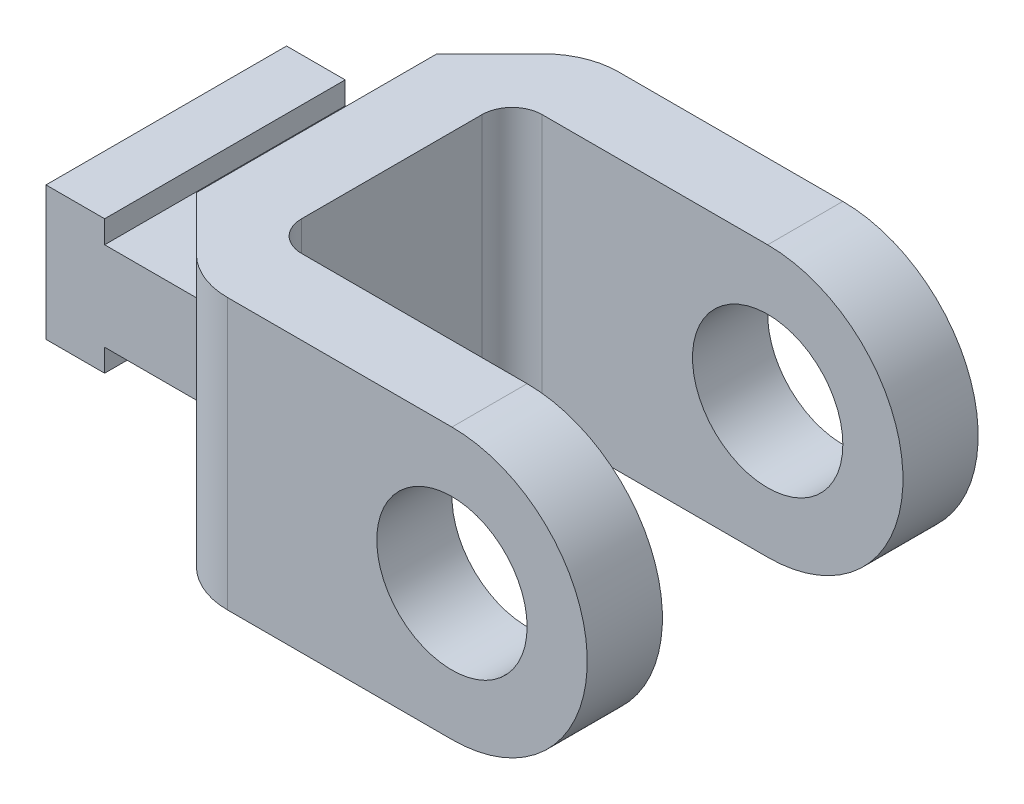
ISO-10303-21;
HEADER;
FILE_DESCRIPTION(('STEP AP214'),'2;1');
FILE_NAME('part.step','',(''),(''),'','','');
FILE_SCHEMA(('AUTOMOTIVE_DESIGN { 1 0 10303 214 1 1 1 1 }'));
ENDSEC;
DATA;
#1=APPLICATION_CONTEXT('core data for automotive mechanical design processes');
#2=APPLICATION_PROTOCOL_DEFINITION('international standard','automotive_design',2000,#1);
#3=PRODUCT_CONTEXT('',#1,'mechanical');
#4=PRODUCT('Part','Part','',(#3));
#5=PRODUCT_RELATED_PRODUCT_CATEGORY('part','',(#4));
#6=PRODUCT_DEFINITION_FORMATION('','',#4);
#7=PRODUCT_DEFINITION_CONTEXT('part definition',#1,'design');
#8=PRODUCT_DEFINITION('design','',#6,#7);
#9=PRODUCT_DEFINITION_SHAPE('','',#8);
#10=(LENGTH_UNIT() NAMED_UNIT(*) SI_UNIT(.MILLI.,.METRE.));
#11=(NAMED_UNIT(*) PLANE_ANGLE_UNIT() SI_UNIT($,.RADIAN.));
#12=(NAMED_UNIT(*) SI_UNIT($,.STERADIAN.) SOLID_ANGLE_UNIT());
#13=UNCERTAINTY_MEASURE_WITH_UNIT(LENGTH_MEASURE(1.E-05),#10,'distance_accuracy_value','');
#14=(GEOMETRIC_REPRESENTATION_CONTEXT(3) GLOBAL_UNCERTAINTY_ASSIGNED_CONTEXT((#13)) GLOBAL_UNIT_ASSIGNED_CONTEXT((#10,
#11,#12)) REPRESENTATION_CONTEXT('',''));
#15=CARTESIAN_POINT('',(0.,0.,0.));
#16=DIRECTION('',(0.,0.,1.));
#17=DIRECTION('',(1.,0.,0.));
#18=AXIS2_PLACEMENT_3D('',#15,#16,#17);
#19=CARTESIAN_POINT('',(1.25,4.5,8.));
#20=DIRECTION('',(0.,-1.,0.));
#21=DIRECTION('',(0.,0.,-1.));
#22=AXIS2_PLACEMENT_3D('',#19,#20,#21);
#23=PLANE('',#22);
#24=DIRECTION('',(-0.707106781186548,0.,-0.707106781186547));
#25=VECTOR('',#24,1.);
#26=CARTESIAN_POINT('',(0.,4.5,9.25));
#27=LINE('',#26,#25);
#28=CARTESIAN_POINT('',(0.517766952966368,4.5,9.76776695296637));
#29=VERTEX_POINT('',#28);
#30=CARTESIAN_POINT('',(-1.25,4.5,8.));
#31=VERTEX_POINT('',#30);
#32=EDGE_CURVE('E193',#29,#31,#27,.T.);
#33=ORIENTED_EDGE('',*,*,#32,.F.);
#34=CARTESIAN_POINT('',(2.28553390593274,4.5,8.));
#35=DIRECTION('',(0.,-1.,0.));
#36=DIRECTION('',(0.,0.,-1.));
#37=AXIS2_PLACEMENT_3D('',#34,#35,#36);
#38=CIRCLE('',#37,2.5);
#39=CARTESIAN_POINT('',(2.28553390593274,4.5,10.5));
#40=VERTEX_POINT('',#39);
#41=EDGE_CURVE('E55',#29,#40,#38,.F.);
#42=ORIENTED_EDGE('',*,*,#41,.T.);
#43=DIRECTION('',(-1.,0.,0.));
#44=VECTOR('',#43,1.);
#45=CARTESIAN_POINT('',(9.75,4.5,10.5));
#46=LINE('',#45,#44);
#47=CARTESIAN_POINT('',(9.75,4.5,10.5));
#48=VERTEX_POINT('',#47);
#49=EDGE_CURVE('E279',#48,#40,#46,.T.);
#50=ORIENTED_EDGE('',*,*,#49,.F.);
#51=DIRECTION('',(0.,0.,-1.));
#52=VECTOR('',#51,1.);
#53=CARTESIAN_POINT('',(9.75,4.5,10.5));
#54=LINE('',#53,#52);
#55=CARTESIAN_POINT('',(9.75,4.5,8.));
#56=VERTEX_POINT('',#55);
#57=EDGE_CURVE('E286',#48,#56,#54,.T.);
#58=ORIENTED_EDGE('',*,*,#57,.T.);
#59=DIRECTION('',(-1.,0.,0.));
#60=VECTOR('',#59,1.);
#61=CARTESIAN_POINT('',(9.75,4.5,8.));
#62=LINE('',#61,#60);
#63=CARTESIAN_POINT('',(2.25,4.5,8.));
#64=VERTEX_POINT('',#63);
#65=EDGE_CURVE('E277',#56,#64,#62,.T.);
#66=ORIENTED_EDGE('',*,*,#65,.T.);
#67=CARTESIAN_POINT('',(2.25,4.5,7.));
#68=DIRECTION('',(0.,-1.,0.));
#69=DIRECTION('',(0.,0.,-1.));
#70=AXIS2_PLACEMENT_3D('',#67,#68,#69);
#71=CIRCLE('',#70,1.);
#72=CARTESIAN_POINT('',(1.25,4.5,7.));
#73=VERTEX_POINT('',#72);
#74=EDGE_CURVE('E260',#64,#73,#71,.T.);
#75=ORIENTED_EDGE('',*,*,#74,.T.);
#76=DIRECTION('',(0.,0.,-1.));
#77=VECTOR('',#76,1.);
#78=CARTESIAN_POINT('',(1.25,4.5,8.));
#79=LINE('',#78,#77);
#80=CARTESIAN_POINT('',(1.25,4.5,1.));
#81=VERTEX_POINT('',#80);
#82=EDGE_CURVE('E233',#73,#81,#79,.T.);
#83=ORIENTED_EDGE('',*,*,#82,.T.);
#84=CARTESIAN_POINT('',(2.25,4.5,1.));
#85=DIRECTION('',(0.,-1.,0.));
#86=DIRECTION('',(0.,0.,-1.));
#87=AXIS2_PLACEMENT_3D('',#84,#85,#86);
#88=CIRCLE('',#87,1.);
#89=CARTESIAN_POINT('',(2.25,4.5,0.));
#90=VERTEX_POINT('',#89);
#91=EDGE_CURVE('E241',#81,#90,#88,.T.);
#92=ORIENTED_EDGE('',*,*,#91,.T.);
#93=DIRECTION('',(-1.,0.,0.));
#94=VECTOR('',#93,1.);
#95=CARTESIAN_POINT('',(9.75,4.5,0.));
#96=LINE('',#95,#94);
#97=CARTESIAN_POINT('',(9.75,4.5,0.));
#98=VERTEX_POINT('',#97);
#99=EDGE_CURVE('E314',#98,#90,#96,.T.);
#100=ORIENTED_EDGE('',*,*,#99,.F.);
#101=DIRECTION('',(0.,0.,1.));
#102=VECTOR('',#101,1.);
#103=CARTESIAN_POINT('',(9.75,4.5,-2.5));
#104=LINE('',#103,#102);
#105=CARTESIAN_POINT('',(9.75,4.5,-2.5));
#106=VERTEX_POINT('',#105);
#107=EDGE_CURVE('E329',#106,#98,#104,.T.);
#108=ORIENTED_EDGE('',*,*,#107,.F.);
#109=DIRECTION('',(-1.,0.,0.));
#110=VECTOR('',#109,1.);
#111=CARTESIAN_POINT('',(9.75,4.5,-2.5));
#112=LINE('',#111,#110);
#113=CARTESIAN_POINT('',(2.28553390593274,4.5,-2.5));
#114=VERTEX_POINT('',#113);
#115=EDGE_CURVE('E317',#106,#114,#112,.T.);
#116=ORIENTED_EDGE('',*,*,#115,.T.);
#117=CARTESIAN_POINT('',(2.28553390593274,4.5,0.));
#118=DIRECTION('',(0.,-1.,0.));
#119=DIRECTION('',(0.,0.,-1.));
#120=AXIS2_PLACEMENT_3D('',#117,#118,#119);
#121=CIRCLE('',#120,2.5);
#122=CARTESIAN_POINT('',(0.517766952966369,4.5,-1.76776695296637));
#123=VERTEX_POINT('',#122);
#124=EDGE_CURVE('E249',#114,#123,#121,.F.);
#125=ORIENTED_EDGE('',*,*,#124,.T.);
#126=DIRECTION('',(-0.707106781186548,0.,0.707106781186547));
#127=VECTOR('',#126,1.);
#128=CARTESIAN_POINT('',(-4.,4.5,2.75));
#129=LINE('',#128,#127);
#130=CARTESIAN_POINT('',(-1.25,4.5,0.));
#131=VERTEX_POINT('',#130);
#132=EDGE_CURVE('E302',#123,#131,#129,.T.);
#133=ORIENTED_EDGE('',*,*,#132,.T.);
#134=DIRECTION('',(0.,0.,-1.));
#135=VECTOR('',#134,1.);
#136=CARTESIAN_POINT('',(-1.25,4.5,8.));
#137=LINE('',#136,#135);
#138=EDGE_CURVE('E231',#31,#131,#137,.T.);
#139=ORIENTED_EDGE('',*,*,#138,.F.);
#140=EDGE_LOOP('',(#33,#42,#50,#58,#66,#75,#83,#92,#100,#108,#116,#125,#133,#139));
#141=FACE_BOUND('',#140,.T.);
#142=ADVANCED_FACE('F33',(#141),#23,.F.);
#143=CARTESIAN_POINT('',(-1.25,-1.475,8.));
#144=DIRECTION('',(1.,0.,0.));
#145=DIRECTION('',(0.,1.,0.));
#146=AXIS2_PLACEMENT_3D('',#143,#144,#145);
#147=PLANE('',#146);
#148=DIRECTION('',(0.,1.,0.));
#149=VECTOR('',#148,1.);
#150=CARTESIAN_POINT('',(-1.25,-4.5,8.));
#151=LINE('',#150,#149);
#152=CARTESIAN_POINT('',(-1.25,1.475,8.));
#153=VERTEX_POINT('',#152);
#154=EDGE_CURVE('E194',#153,#31,#151,.T.);
#155=ORIENTED_EDGE('',*,*,#154,.T.);
#156=ORIENTED_EDGE('',*,*,#138,.T.);
#157=DIRECTION('',(0.,1.,0.));
#158=VECTOR('',#157,1.);
#159=CARTESIAN_POINT('',(-1.25,-4.5,0.));
#160=LINE('',#159,#158);
#161=CARTESIAN_POINT('',(-1.25,1.475,0.));
#162=VERTEX_POINT('',#161);
#163=EDGE_CURVE('E300',#162,#131,#160,.T.);
#164=ORIENTED_EDGE('',*,*,#163,.F.);
#165=DIRECTION('',(0.,0.,-1.));
#166=VECTOR('',#165,1.);
#167=CARTESIAN_POINT('',(-1.25,1.475,8.));
#168=LINE('',#167,#166);
#169=EDGE_CURVE('E228',#153,#162,#168,.T.);
#170=ORIENTED_EDGE('',*,*,#169,.F.);
#171=EDGE_LOOP('',(#155,#156,#164,#170));
#172=FACE_BOUND('',#171,.T.);
#173=ADVANCED_FACE('F385',(#172),#147,.F.);
#174=CARTESIAN_POINT('',(-1.25,-4.5,8.));
#175=VERTEX_POINT('',#174);
#176=CARTESIAN_POINT('',(-1.25,-1.475,8.));
#177=VERTEX_POINT('',#176);
#178=EDGE_CURVE('E181',#175,#177,#151,.T.);
#179=ORIENTED_EDGE('',*,*,#178,.T.);
#180=DIRECTION('',(0.,0.,-1.));
#181=VECTOR('',#180,1.);
#182=CARTESIAN_POINT('',(-1.25,-1.475,8.));
#183=LINE('',#182,#181);
#184=CARTESIAN_POINT('',(-1.25,-1.475,0.));
#185=VERTEX_POINT('',#184);
#186=EDGE_CURVE('E206',#177,#185,#183,.T.);
#187=ORIENTED_EDGE('',*,*,#186,.T.);
#188=CARTESIAN_POINT('',(-1.25,-4.5,0.));
#189=VERTEX_POINT('',#188);
#190=EDGE_CURVE('E205',#189,#185,#160,.T.);
#191=ORIENTED_EDGE('',*,*,#190,.F.);
#192=DIRECTION('',(0.,0.,-1.));
#193=VECTOR('',#192,1.);
#194=CARTESIAN_POINT('',(-1.25,-4.5,8.));
#195=LINE('',#194,#193);
#196=EDGE_CURVE('E199',#175,#189,#195,.T.);
#197=ORIENTED_EDGE('',*,*,#196,.F.);
#198=EDGE_LOOP('',(#179,#187,#191,#197));
#199=FACE_BOUND('',#198,.T.);
#200=ADVANCED_FACE('F204',(#199),#147,.F.);
#201=CARTESIAN_POINT('',(1.25,-4.5,8.));
#202=DIRECTION('',(0.,-1.,0.));
#203=DIRECTION('',(0.,0.,-1.));
#204=AXIS2_PLACEMENT_3D('',#201,#202,#203);
#205=PLANE('',#204);
#206=DIRECTION('',(1.,0.,0.));
#207=VECTOR('',#206,1.);
#208=CARTESIAN_POINT('',(9.75,-4.5,10.5));
#209=LINE('',#208,#207);
#210=CARTESIAN_POINT('',(2.28553390593274,-4.5,10.5));
#211=VERTEX_POINT('',#210);
#212=CARTESIAN_POINT('',(9.75,-4.5,10.5));
#213=VERTEX_POINT('',#212);
#214=EDGE_CURVE('E284',#211,#213,#209,.T.);
#215=ORIENTED_EDGE('',*,*,#214,.F.);
#216=CARTESIAN_POINT('',(2.28553390593274,-4.5,8.));
#217=DIRECTION('',(0.,-1.,0.));
#218=DIRECTION('',(0.,0.,-1.));
#219=AXIS2_PLACEMENT_3D('',#216,#217,#218);
#220=CIRCLE('',#219,2.5);
#221=CARTESIAN_POINT('',(0.517766952966369,-4.5,9.76776695296637));
#222=VERTEX_POINT('',#221);
#223=EDGE_CURVE('E11',#211,#222,#220,.T.);
#224=ORIENTED_EDGE('',*,*,#223,.T.);
#225=DIRECTION('',(0.707106781186548,0.,0.707106781186547));
#226=VECTOR('',#225,1.);
#227=CARTESIAN_POINT('',(-1.25,-4.5,8.));
#228=LINE('',#227,#226);
#229=EDGE_CURVE('E185',#175,#222,#228,.T.);
#230=ORIENTED_EDGE('',*,*,#229,.F.);
#231=ORIENTED_EDGE('',*,*,#196,.T.);
#232=DIRECTION('',(0.707106781186548,0.,-0.707106781186547));
#233=VECTOR('',#232,1.);
#234=CARTESIAN_POINT('',(-1.25,-4.5,0.));
#235=LINE('',#234,#233);
#236=CARTESIAN_POINT('',(0.51776695296637,-4.5,-1.76776695296637));
#237=VERTEX_POINT('',#236);
#238=EDGE_CURVE('E296',#189,#237,#235,.T.);
#239=ORIENTED_EDGE('',*,*,#238,.T.);
#240=CARTESIAN_POINT('',(2.28553390593274,-4.5,0.));
#241=DIRECTION('',(0.,-1.,0.));
#242=DIRECTION('',(0.,0.,-1.));
#243=AXIS2_PLACEMENT_3D('',#240,#241,#242);
#244=CIRCLE('',#243,2.5);
#245=CARTESIAN_POINT('',(2.28553390593274,-4.5,-2.5));
#246=VERTEX_POINT('',#245);
#247=EDGE_CURVE('E253',#237,#246,#244,.T.);
#248=ORIENTED_EDGE('',*,*,#247,.T.);
#249=DIRECTION('',(1.,0.,0.));
#250=VECTOR('',#249,1.);
#251=CARTESIAN_POINT('',(9.75,-4.5,-2.5));
#252=LINE('',#251,#250);
#253=CARTESIAN_POINT('',(9.75,-4.5,-2.5));
#254=VERTEX_POINT('',#253);
#255=EDGE_CURVE('E311',#246,#254,#252,.T.);
#256=ORIENTED_EDGE('',*,*,#255,.T.);
#257=DIRECTION('',(0.,0.,1.));
#258=VECTOR('',#257,1.);
#259=CARTESIAN_POINT('',(9.75,-4.5,-2.5));
#260=LINE('',#259,#258);
#261=CARTESIAN_POINT('',(9.75,-4.5,0.));
#262=VERTEX_POINT('',#261);
#263=EDGE_CURVE('E320',#254,#262,#260,.T.);
#264=ORIENTED_EDGE('',*,*,#263,.T.);
#265=DIRECTION('',(1.,0.,0.));
#266=VECTOR('',#265,1.);
#267=CARTESIAN_POINT('',(9.75,-4.5,0.));
#268=LINE('',#267,#266);
#269=CARTESIAN_POINT('',(2.25,-4.5,0.));
#270=VERTEX_POINT('',#269);
#271=EDGE_CURVE('E308',#270,#262,#268,.T.);
#272=ORIENTED_EDGE('',*,*,#271,.F.);
#273=CARTESIAN_POINT('',(2.25,-4.5,1.));
#274=DIRECTION('',(0.,-1.,0.));
#275=DIRECTION('',(0.,0.,-1.));
#276=AXIS2_PLACEMENT_3D('',#273,#274,#275);
#277=CIRCLE('',#276,1.);
#278=CARTESIAN_POINT('',(1.25,-4.5,1.));
#279=VERTEX_POINT('',#278);
#280=EDGE_CURVE('E243',#270,#279,#277,.F.);
#281=ORIENTED_EDGE('',*,*,#280,.T.);
#282=DIRECTION('',(0.,0.,-1.));
#283=VECTOR('',#282,1.);
#284=CARTESIAN_POINT('',(1.25,-4.5,8.));
#285=LINE('',#284,#283);
#286=CARTESIAN_POINT('',(1.25,-4.5,7.));
#287=VERTEX_POINT('',#286);
#288=EDGE_CURVE('E207',#287,#279,#285,.T.);
#289=ORIENTED_EDGE('',*,*,#288,.F.);
#290=CARTESIAN_POINT('',(2.25,-4.5,7.));
#291=DIRECTION('',(0.,-1.,0.));
#292=DIRECTION('',(0.,0.,-1.));
#293=AXIS2_PLACEMENT_3D('',#290,#291,#292);
#294=CIRCLE('',#293,1.);
#295=CARTESIAN_POINT('',(2.25,-4.5,8.));
#296=VERTEX_POINT('',#295);
#297=EDGE_CURVE('E262',#287,#296,#294,.F.);
#298=ORIENTED_EDGE('',*,*,#297,.T.);
#299=DIRECTION('',(1.,0.,0.));
#300=VECTOR('',#299,1.);
#301=CARTESIAN_POINT('',(9.75,-4.5,8.));
#302=LINE('',#301,#300);
#303=CARTESIAN_POINT('',(9.75,-4.5,8.));
#304=VERTEX_POINT('',#303);
#305=EDGE_CURVE('E282',#296,#304,#302,.T.);
#306=ORIENTED_EDGE('',*,*,#305,.T.);
#307=DIRECTION('',(0.,0.,-1.));
#308=VECTOR('',#307,1.);
#309=CARTESIAN_POINT('',(9.75,-4.5,10.5));
#310=LINE('',#309,#308);
#311=EDGE_CURVE('E293',#213,#304,#310,.T.);
#312=ORIENTED_EDGE('',*,*,#311,.F.);
#313=EDGE_LOOP('',(#215,#224,#230,#231,#239,#248,#256,#264,#272,#281,#289,#298,#306,#312));
#314=FACE_BOUND('',#313,.T.);
#315=ADVANCED_FACE('F197',(#314),#205,.T.);
#316=CARTESIAN_POINT('',(9.75,0.,10.5));
#317=DIRECTION('',(0.,0.,-1.));
#318=DIRECTION('',(1.,0.,0.));
#319=AXIS2_PLACEMENT_3D('',#316,#317,#318);
#320=PLANE('',#319);
#321=CARTESIAN_POINT('',(9.75,0.,10.5));
#322=DIRECTION('',(0.,0.,1.));
#323=DIRECTION('',(1.,0.,0.));
#324=AXIS2_PLACEMENT_3D('',#321,#322,#323);
#325=CIRCLE('',#324,2.5);
#326=CARTESIAN_POINT('',(12.25,0.,10.5));
#327=VERTEX_POINT('',#326);
#328=EDGE_CURVE('E273',#327,#327,#325,.T.);
#329=ORIENTED_EDGE('',*,*,#328,.F.);
#330=EDGE_LOOP('',(#329));
#331=FACE_BOUND('',#330,.T.);
#332=ORIENTED_EDGE('',*,*,#49,.T.);
#333=DIRECTION('',(0.,1.,0.));
#334=VECTOR('',#333,1.);
#335=CARTESIAN_POINT('',(2.28553390593274,-4.5,10.5));
#336=LINE('',#335,#334);
#337=EDGE_CURVE('E41',#40,#211,#336,.F.);
#338=ORIENTED_EDGE('',*,*,#337,.T.);
#339=ORIENTED_EDGE('',*,*,#214,.T.);
#340=CARTESIAN_POINT('',(9.75,0.,10.5));
#341=DIRECTION('',(0.,0.,1.));
#342=DIRECTION('',(1.,0.,0.));
#343=AXIS2_PLACEMENT_3D('',#340,#341,#342);
#344=CIRCLE('',#343,4.5);
#345=EDGE_CURVE('E281',#213,#48,#344,.T.);
#346=ORIENTED_EDGE('',*,*,#345,.T.);
#347=EDGE_LOOP('',(#332,#338,#339,#346));
#348=FACE_BOUND('',#347,.T.);
#349=ADVANCED_FACE('F428',(#331,#348),#320,.F.);
#350=CARTESIAN_POINT('',(1.25,-4.5,8.));
#351=DIRECTION('',(-1.,0.,0.));
#352=DIRECTION('',(0.,0.,1.));
#353=AXIS2_PLACEMENT_3D('',#350,#351,#352);
#354=PLANE('',#353);
#355=ORIENTED_EDGE('',*,*,#82,.F.);
#356=DIRECTION('',(0.,1.,0.));
#357=VECTOR('',#356,1.);
#358=CARTESIAN_POINT('',(1.25,-4.5,7.));
#359=LINE('',#358,#357);
#360=EDGE_CURVE('E258',#73,#287,#359,.F.);
#361=ORIENTED_EDGE('',*,*,#360,.T.);
#362=ORIENTED_EDGE('',*,*,#288,.T.);
#363=DIRECTION('',(0.,1.,0.));
#364=VECTOR('',#363,1.);
#365=CARTESIAN_POINT('',(1.25,-4.5,1.));
#366=LINE('',#365,#364);
#367=EDGE_CURVE('E236',#279,#81,#366,.T.);
#368=ORIENTED_EDGE('',*,*,#367,.T.);
#369=EDGE_LOOP('',(#355,#361,#362,#368));
#370=FACE_BOUND('',#369,.T.);
#371=ADVANCED_FACE('F417',(#370),#354,.F.);
#372=CARTESIAN_POINT('',(-4.3,1.475,8.));
#373=DIRECTION('',(0.,1.,0.));
#374=DIRECTION('',(-1.,0.,0.));
#375=AXIS2_PLACEMENT_3D('',#372,#373,#374);
#376=PLANE('',#375);
#377=DIRECTION('',(1.,0.,0.));
#378=VECTOR('',#377,1.);
#379=CARTESIAN_POINT('',(-4.3,1.475,0.));
#380=LINE('',#379,#378);
#381=CARTESIAN_POINT('',(-4.3,1.475,0.));
#382=VERTEX_POINT('',#381);
#383=EDGE_CURVE('E331',#382,#162,#380,.T.);
#384=ORIENTED_EDGE('',*,*,#383,.F.);
#385=DIRECTION('',(0.,0.,-1.));
#386=VECTOR('',#385,1.);
#387=CARTESIAN_POINT('',(-4.3,1.475,8.));
#388=LINE('',#387,#386);
#389=CARTESIAN_POINT('',(-4.3,1.475,8.));
#390=VERTEX_POINT('',#389);
#391=EDGE_CURVE('E226',#390,#382,#388,.T.);
#392=ORIENTED_EDGE('',*,*,#391,.F.);
#393=DIRECTION('',(1.,0.,0.));
#394=VECTOR('',#393,1.);
#395=CARTESIAN_POINT('',(-4.3,1.475,8.));
#396=LINE('',#395,#394);
#397=EDGE_CURVE('E334',#390,#153,#396,.T.);
#398=ORIENTED_EDGE('',*,*,#397,.T.);
#399=ORIENTED_EDGE('',*,*,#169,.T.);
#400=EDGE_LOOP('',(#384,#392,#398,#399));
#401=FACE_BOUND('',#400,.T.);
#402=ADVANCED_FACE('F387',(#401),#376,.T.);
#403=CARTESIAN_POINT('',(-4.3,1.475,8.));
#404=DIRECTION('',(-1.,0.,0.));
#405=DIRECTION('',(0.,0.,1.));
#406=AXIS2_PLACEMENT_3D('',#403,#404,#405);
#407=PLANE('',#406);
#408=DIRECTION('',(0.,1.,0.));
#409=VECTOR('',#408,1.);
#410=CARTESIAN_POINT('',(-4.3,1.475,0.));
#411=LINE('',#410,#409);
#412=CARTESIAN_POINT('',(-4.3,2.225,0.));
#413=VERTEX_POINT('',#412);
#414=EDGE_CURVE('E353',#382,#413,#411,.T.);
#415=ORIENTED_EDGE('',*,*,#414,.T.);
#416=DIRECTION('',(0.,0.,-1.));
#417=VECTOR('',#416,1.);
#418=CARTESIAN_POINT('',(-4.3,2.225,8.));
#419=LINE('',#418,#417);
#420=CARTESIAN_POINT('',(-4.3,2.225,8.));
#421=VERTEX_POINT('',#420);
#422=EDGE_CURVE('E224',#421,#413,#419,.T.);
#423=ORIENTED_EDGE('',*,*,#422,.F.);
#424=DIRECTION('',(0.,1.,0.));
#425=VECTOR('',#424,1.);
#426=CARTESIAN_POINT('',(-4.3,1.475,8.));
#427=LINE('',#426,#425);
#428=EDGE_CURVE('E337',#390,#421,#427,.T.);
#429=ORIENTED_EDGE('',*,*,#428,.F.);
#430=ORIENTED_EDGE('',*,*,#391,.T.);
#431=EDGE_LOOP('',(#415,#423,#429,#430));
#432=FACE_BOUND('',#431,.T.);
#433=ADVANCED_FACE('F409',(#432),#407,.F.);
#434=CARTESIAN_POINT('',(-6.25,2.225,8.));
#435=DIRECTION('',(0.,1.,0.));
#436=DIRECTION('',(0.,0.,1.));
#437=AXIS2_PLACEMENT_3D('',#434,#435,#436);
#438=PLANE('',#437);
#439=DIRECTION('',(1.,0.,0.));
#440=VECTOR('',#439,1.);
#441=CARTESIAN_POINT('',(-6.25,2.225,0.));
#442=LINE('',#441,#440);
#443=CARTESIAN_POINT('',(-6.25,2.225,0.));
#444=VERTEX_POINT('',#443);
#445=EDGE_CURVE('E356',#444,#413,#442,.T.);
#446=ORIENTED_EDGE('',*,*,#445,.F.);
#447=DIRECTION('',(0.,0.,-1.));
#448=VECTOR('',#447,1.);
#449=CARTESIAN_POINT('',(-6.25,2.225,8.));
#450=LINE('',#449,#448);
#451=CARTESIAN_POINT('',(-6.25,2.225,8.));
#452=VERTEX_POINT('',#451);
#453=EDGE_CURVE('E222',#452,#444,#450,.T.);
#454=ORIENTED_EDGE('',*,*,#453,.F.);
#455=DIRECTION('',(1.,0.,0.));
#456=VECTOR('',#455,1.);
#457=CARTESIAN_POINT('',(-6.25,2.225,8.));
#458=LINE('',#457,#456);
#459=EDGE_CURVE('E340',#452,#421,#458,.T.);
#460=ORIENTED_EDGE('',*,*,#459,.T.);
#461=ORIENTED_EDGE('',*,*,#422,.T.);
#462=EDGE_LOOP('',(#446,#454,#460,#461));
#463=FACE_BOUND('',#462,.T.);
#464=ADVANCED_FACE('F407',(#463),#438,.T.);
#465=CARTESIAN_POINT('',(-6.25,-2.225,8.));
#466=DIRECTION('',(-1.,0.,0.));
#467=DIRECTION('',(0.,-1.,0.));
#468=AXIS2_PLACEMENT_3D('',#465,#466,#467);
#469=PLANE('',#468);
#470=DIRECTION('',(0.,1.,0.));
#471=VECTOR('',#470,1.);
#472=CARTESIAN_POINT('',(-6.25,-2.225,0.));
#473=LINE('',#472,#471);
#474=CARTESIAN_POINT('',(-6.25,-2.225,0.));
#475=VERTEX_POINT('',#474);
#476=EDGE_CURVE('E359',#475,#444,#473,.T.);
#477=ORIENTED_EDGE('',*,*,#476,.F.);
#478=DIRECTION('',(0.,0.,-1.));
#479=VECTOR('',#478,1.);
#480=CARTESIAN_POINT('',(-6.25,-2.225,8.));
#481=LINE('',#480,#479);
#482=CARTESIAN_POINT('',(-6.25,-2.225,8.));
#483=VERTEX_POINT('',#482);
#484=EDGE_CURVE('E220',#483,#475,#481,.T.);
#485=ORIENTED_EDGE('',*,*,#484,.F.);
#486=DIRECTION('',(0.,1.,0.));
#487=VECTOR('',#486,1.);
#488=CARTESIAN_POINT('',(-6.25,-2.225,8.));
#489=LINE('',#488,#487);
#490=EDGE_CURVE('E343',#483,#452,#489,.T.);
#491=ORIENTED_EDGE('',*,*,#490,.T.);
#492=ORIENTED_EDGE('',*,*,#453,.T.);
#493=EDGE_LOOP('',(#477,#485,#491,#492));
#494=FACE_BOUND('',#493,.T.);
#495=ADVANCED_FACE('F404',(#494),#469,.T.);
#496=CARTESIAN_POINT('',(-6.25,-2.225,8.));
#497=DIRECTION('',(0.,1.,0.));
#498=DIRECTION('',(0.,0.,1.));
#499=AXIS2_PLACEMENT_3D('',#496,#497,#498);
#500=PLANE('',#499);
#501=DIRECTION('',(1.,0.,0.));
#502=VECTOR('',#501,1.);
#503=CARTESIAN_POINT('',(-6.25,-2.225,0.));
#504=LINE('',#503,#502);
#505=CARTESIAN_POINT('',(-4.3,-2.225,0.));
#506=VERTEX_POINT('',#505);
#507=EDGE_CURVE('E362',#475,#506,#504,.T.);
#508=ORIENTED_EDGE('',*,*,#507,.T.);
#509=DIRECTION('',(0.,0.,-1.));
#510=VECTOR('',#509,1.);
#511=CARTESIAN_POINT('',(-4.3,-2.225,8.));
#512=LINE('',#511,#510);
#513=CARTESIAN_POINT('',(-4.3,-2.225,8.));
#514=VERTEX_POINT('',#513);
#515=EDGE_CURVE('E217',#514,#506,#512,.T.);
#516=ORIENTED_EDGE('',*,*,#515,.F.);
#517=DIRECTION('',(1.,0.,0.));
#518=VECTOR('',#517,1.);
#519=CARTESIAN_POINT('',(-6.25,-2.225,8.));
#520=LINE('',#519,#518);
#521=EDGE_CURVE('E346',#483,#514,#520,.T.);
#522=ORIENTED_EDGE('',*,*,#521,.F.);
#523=ORIENTED_EDGE('',*,*,#484,.T.);
#524=EDGE_LOOP('',(#508,#516,#522,#523));
#525=FACE_BOUND('',#524,.T.);
#526=ADVANCED_FACE('F401',(#525),#500,.F.);
#527=CARTESIAN_POINT('',(-4.3,-2.225,8.));
#528=DIRECTION('',(-1.,0.,0.));
#529=DIRECTION('',(0.,0.,1.));
#530=AXIS2_PLACEMENT_3D('',#527,#528,#529);
#531=PLANE('',#530);
#532=DIRECTION('',(0.,1.,0.));
#533=VECTOR('',#532,1.);
#534=CARTESIAN_POINT('',(-4.3,-2.225,0.));
#535=LINE('',#534,#533);
#536=CARTESIAN_POINT('',(-4.3,-1.475,0.));
#537=VERTEX_POINT('',#536);
#538=EDGE_CURVE('E364',#506,#537,#535,.T.);
#539=ORIENTED_EDGE('',*,*,#538,.T.);
#540=DIRECTION('',(0.,0.,-1.));
#541=VECTOR('',#540,1.);
#542=CARTESIAN_POINT('',(-4.3,-1.475,8.));
#543=LINE('',#542,#541);
#544=CARTESIAN_POINT('',(-4.3,-1.475,8.));
#545=VERTEX_POINT('',#544);
#546=EDGE_CURVE('E209',#545,#537,#543,.T.);
#547=ORIENTED_EDGE('',*,*,#546,.F.);
#548=DIRECTION('',(0.,1.,0.));
#549=VECTOR('',#548,1.);
#550=CARTESIAN_POINT('',(-4.3,-2.225,8.));
#551=LINE('',#550,#549);
#552=EDGE_CURVE('E348',#514,#545,#551,.T.);
#553=ORIENTED_EDGE('',*,*,#552,.F.);
#554=ORIENTED_EDGE('',*,*,#515,.T.);
#555=EDGE_LOOP('',(#539,#547,#553,#554));
#556=FACE_BOUND('',#555,.T.);
#557=ADVANCED_FACE('F399',(#556),#531,.F.);
#558=CARTESIAN_POINT('',(-4.3,-1.475,8.));
#559=DIRECTION('',(0.,1.,0.));
#560=DIRECTION('',(0.,0.,1.));
#561=AXIS2_PLACEMENT_3D('',#558,#559,#560);
#562=PLANE('',#561);
#563=DIRECTION('',(1.,0.,0.));
#564=VECTOR('',#563,1.);
#565=CARTESIAN_POINT('',(-4.3,-1.475,0.));
#566=LINE('',#565,#564);
#567=EDGE_CURVE('E338',#537,#185,#566,.T.);
#568=ORIENTED_EDGE('',*,*,#567,.T.);
#569=ORIENTED_EDGE('',*,*,#186,.F.);
#570=DIRECTION('',(1.,0.,0.));
#571=VECTOR('',#570,1.);
#572=CARTESIAN_POINT('',(-4.3,-1.475,8.));
#573=LINE('',#572,#571);
#574=EDGE_CURVE('E211',#545,#177,#573,.T.);
#575=ORIENTED_EDGE('',*,*,#574,.F.);
#576=ORIENTED_EDGE('',*,*,#546,.T.);
#577=EDGE_LOOP('',(#568,#569,#575,#576));
#578=FACE_BOUND('',#577,.T.);
#579=ADVANCED_FACE('F369',(#578),#562,.F.);
#580=CARTESIAN_POINT('',(0.,0.,8.));
#581=DIRECTION('',(0.,0.,1.));
#582=DIRECTION('',(1.,0.,0.));
#583=AXIS2_PLACEMENT_3D('',#580,#581,#582);
#584=PLANE('',#583);
#585=DIRECTION('',(0.,-1.,0.));
#586=VECTOR('',#585,1.);
#587=CARTESIAN_POINT('',(-1.25,-4.5,8.));
#588=LINE('',#587,#586);
#589=EDGE_CURVE('E188',#153,#177,#588,.T.);
#590=ORIENTED_EDGE('',*,*,#589,.F.);
#591=ORIENTED_EDGE('',*,*,#397,.F.);
#592=ORIENTED_EDGE('',*,*,#428,.T.);
#593=ORIENTED_EDGE('',*,*,#459,.F.);
#594=ORIENTED_EDGE('',*,*,#490,.F.);
#595=ORIENTED_EDGE('',*,*,#521,.T.);
#596=ORIENTED_EDGE('',*,*,#552,.T.);
#597=ORIENTED_EDGE('',*,*,#574,.T.);
#598=EDGE_LOOP('',(#590,#591,#592,#593,#594,#595,#596,#597));
#599=FACE_BOUND('',#598,.T.);
#600=ADVANCED_FACE('F391',(#599),#584,.T.);
#601=CARTESIAN_POINT('',(0.,0.,0.));
#602=DIRECTION('',(0.,0.,1.));
#603=DIRECTION('',(1.,0.,0.));
#604=AXIS2_PLACEMENT_3D('',#601,#602,#603);
#605=PLANE('',#604);
#606=ORIENTED_EDGE('',*,*,#383,.T.);
#607=DIRECTION('',(0.,-1.,0.));
#608=VECTOR('',#607,1.);
#609=CARTESIAN_POINT('',(-1.25,-4.5,0.));
#610=LINE('',#609,#608);
#611=EDGE_CURVE('E235',#162,#185,#610,.T.);
#612=ORIENTED_EDGE('',*,*,#611,.T.);
#613=ORIENTED_EDGE('',*,*,#567,.F.);
#614=ORIENTED_EDGE('',*,*,#538,.F.);
#615=ORIENTED_EDGE('',*,*,#507,.F.);
#616=ORIENTED_EDGE('',*,*,#476,.T.);
#617=ORIENTED_EDGE('',*,*,#445,.T.);
#618=ORIENTED_EDGE('',*,*,#414,.F.);
#619=EDGE_LOOP('',(#606,#612,#613,#614,#615,#616,#617,#618));
#620=FACE_BOUND('',#619,.T.);
#621=ADVANCED_FACE('F374',(#620),#605,.F.);
#622=CARTESIAN_POINT('',(9.75,0.,0.));
#623=DIRECTION('',(0.,0.,1.));
#624=DIRECTION('',(1.,0.,0.));
#625=AXIS2_PLACEMENT_3D('',#622,#623,#624);
#626=PLANE('',#625);
#627=CARTESIAN_POINT('',(9.75,0.,0.));
#628=DIRECTION('',(0.,0.,1.));
#629=DIRECTION('',(1.,0.,0.));
#630=AXIS2_PLACEMENT_3D('',#627,#628,#629);
#631=CIRCLE('',#630,2.5);
#632=CARTESIAN_POINT('',(12.25,0.,0.));
#633=VERTEX_POINT('',#632);
#634=EDGE_CURVE('E304',#633,#633,#631,.T.);
#635=ORIENTED_EDGE('',*,*,#634,.F.);
#636=EDGE_LOOP('',(#635));
#637=FACE_BOUND('',#636,.T.);
#638=ORIENTED_EDGE('',*,*,#99,.T.);
#639=DIRECTION('',(0.,1.,0.));
#640=VECTOR('',#639,1.);
#641=CARTESIAN_POINT('',(2.25,0.,0.));
#642=LINE('',#641,#640);
#643=EDGE_CURVE('E239',#90,#270,#642,.F.);
#644=ORIENTED_EDGE('',*,*,#643,.T.);
#645=ORIENTED_EDGE('',*,*,#271,.T.);
#646=CARTESIAN_POINT('',(9.75,0.,0.));
#647=DIRECTION('',(0.,0.,1.));
#648=DIRECTION('',(1.,0.,0.));
#649=AXIS2_PLACEMENT_3D('',#646,#647,#648);
#650=CIRCLE('',#649,4.5);
#651=EDGE_CURVE('E324',#262,#98,#650,.T.);
#652=ORIENTED_EDGE('',*,*,#651,.T.);
#653=EDGE_LOOP('',(#638,#644,#645,#652));
#654=FACE_BOUND('',#653,.T.);
#655=ADVANCED_FACE('F486',(#637,#654),#626,.T.);
#656=CARTESIAN_POINT('',(9.75,0.,-2.5));
#657=DIRECTION('',(0.,0.,1.));
#658=DIRECTION('',(1.,0.,0.));
#659=AXIS2_PLACEMENT_3D('',#656,#657,#658);
#660=CYLINDRICAL_SURFACE('',#659,4.5);
#661=ORIENTED_EDGE('',*,*,#651,.F.);
#662=ORIENTED_EDGE('',*,*,#263,.F.);
#663=CARTESIAN_POINT('',(9.75,0.,-2.5));
#664=DIRECTION('',(0.,0.,1.));
#665=DIRECTION('',(1.,0.,0.));
#666=AXIS2_PLACEMENT_3D('',#663,#664,#665);
#667=CIRCLE('',#666,4.5);
#668=EDGE_CURVE('E313',#254,#106,#667,.T.);
#669=ORIENTED_EDGE('',*,*,#668,.T.);
#670=ORIENTED_EDGE('',*,*,#107,.T.);
#671=EDGE_LOOP('',(#661,#662,#669,#670));
#672=FACE_BOUND('',#671,.T.);
#673=ADVANCED_FACE('F484',(#672),#660,.T.);
#674=CARTESIAN_POINT('',(9.75,0.,-2.5));
#675=DIRECTION('',(0.,0.,1.));
#676=DIRECTION('',(1.,0.,0.));
#677=AXIS2_PLACEMENT_3D('',#674,#675,#676);
#678=PLANE('',#677);
#679=CARTESIAN_POINT('',(9.75,0.,-2.5));
#680=DIRECTION('',(0.,0.,1.));
#681=DIRECTION('',(1.,0.,0.));
#682=AXIS2_PLACEMENT_3D('',#679,#680,#681);
#683=CIRCLE('',#682,2.5);
#684=CARTESIAN_POINT('',(12.25,0.,-2.5));
#685=VERTEX_POINT('',#684);
#686=EDGE_CURVE('E305',#685,#685,#683,.T.);
#687=ORIENTED_EDGE('',*,*,#686,.T.);
#688=EDGE_LOOP('',(#687));
#689=FACE_BOUND('',#688,.T.);
#690=ORIENTED_EDGE('',*,*,#255,.F.);
#691=DIRECTION('',(0.,1.,0.));
#692=VECTOR('',#691,1.);
#693=CARTESIAN_POINT('',(2.28553390593274,0.,-2.5));
#694=LINE('',#693,#692);
#695=EDGE_CURVE('E246',#246,#114,#694,.T.);
#696=ORIENTED_EDGE('',*,*,#695,.T.);
#697=ORIENTED_EDGE('',*,*,#115,.F.);
#698=ORIENTED_EDGE('',*,*,#668,.F.);
#699=EDGE_LOOP('',(#690,#696,#697,#698));
#700=FACE_BOUND('',#699,.T.);
#701=ADVANCED_FACE('F480',(#689,#700),#678,.F.);
#702=CARTESIAN_POINT('',(9.75,0.,-2.5));
#703=DIRECTION('',(0.,0.,1.));
#704=DIRECTION('',(1.,0.,0.));
#705=AXIS2_PLACEMENT_3D('',#702,#703,#704);
#706=CYLINDRICAL_SURFACE('',#705,2.5);
#707=ORIENTED_EDGE('',*,*,#686,.F.);
#708=EDGE_LOOP('',(#707));
#709=FACE_BOUND('',#708,.T.);
#710=ORIENTED_EDGE('',*,*,#634,.T.);
#711=EDGE_LOOP('',(#710));
#712=FACE_BOUND('',#711,.T.);
#713=ADVANCED_FACE('F477',(#709,#712),#706,.F.);
#714=CARTESIAN_POINT('',(-1.25,-4.5,0.));
#715=DIRECTION('',(0.707106781186547,0.,0.707106781186548));
#716=DIRECTION('',(0.707106781186548,0.,-0.707106781186547));
#717=AXIS2_PLACEMENT_3D('',#714,#715,#716);
#718=PLANE('',#717);
#719=ORIENTED_EDGE('',*,*,#132,.F.);
#720=DIRECTION('',(0.,1.,0.));
#721=VECTOR('',#720,1.);
#722=CARTESIAN_POINT('',(0.517766952966369,-4.5,-1.76776695296637));
#723=LINE('',#722,#721);
#724=EDGE_CURVE('E251',#123,#237,#723,.F.);
#725=ORIENTED_EDGE('',*,*,#724,.T.);
#726=ORIENTED_EDGE('',*,*,#238,.F.);
#727=ORIENTED_EDGE('',*,*,#190,.T.);
#728=ORIENTED_EDGE('',*,*,#611,.F.);
#729=ORIENTED_EDGE('',*,*,#163,.T.);
#730=EDGE_LOOP('',(#719,#725,#726,#727,#728,#729));
#731=FACE_BOUND('',#730,.T.);
#732=ADVANCED_FACE('F382',(#731),#718,.F.);
#733=CARTESIAN_POINT('',(2.25,-4.5,1.));
#734=DIRECTION('',(0.,1.,0.));
#735=DIRECTION('',(0.,0.,1.));
#736=AXIS2_PLACEMENT_3D('',#733,#734,#735);
#737=CYLINDRICAL_SURFACE('',#736,1.);
#738=ORIENTED_EDGE('',*,*,#280,.F.);
#739=ORIENTED_EDGE('',*,*,#643,.F.);
#740=ORIENTED_EDGE('',*,*,#91,.F.);
#741=ORIENTED_EDGE('',*,*,#367,.F.);
#742=EDGE_LOOP('',(#738,#739,#740,#741));
#743=FACE_BOUND('',#742,.T.);
#744=ADVANCED_FACE('F430',(#743),#737,.F.);
#745=CARTESIAN_POINT('',(2.28553390593274,0.,0.));
#746=DIRECTION('',(0.,1.,0.));
#747=DIRECTION('',(0.,0.,1.));
#748=AXIS2_PLACEMENT_3D('',#745,#746,#747);
#749=CYLINDRICAL_SURFACE('',#748,2.5);
#750=ORIENTED_EDGE('',*,*,#247,.F.);
#751=ORIENTED_EDGE('',*,*,#724,.F.);
#752=ORIENTED_EDGE('',*,*,#124,.F.);
#753=ORIENTED_EDGE('',*,*,#695,.F.);
#754=EDGE_LOOP('',(#750,#751,#752,#753));
#755=FACE_BOUND('',#754,.T.);
#756=ADVANCED_FACE('F433',(#755),#749,.T.);
#757=CARTESIAN_POINT('',(9.75,0.,8.));
#758=DIRECTION('',(0.,0.,-1.));
#759=DIRECTION('',(1.,0.,0.));
#760=AXIS2_PLACEMENT_3D('',#757,#758,#759);
#761=PLANE('',#760);
#762=ORIENTED_EDGE('',*,*,#305,.F.);
#763=DIRECTION('',(0.,1.,0.));
#764=VECTOR('',#763,1.);
#765=CARTESIAN_POINT('',(2.25,0.,8.));
#766=LINE('',#765,#764);
#767=EDGE_CURVE('E255',#296,#64,#766,.T.);
#768=ORIENTED_EDGE('',*,*,#767,.T.);
#769=ORIENTED_EDGE('',*,*,#65,.F.);
#770=CARTESIAN_POINT('',(9.75,0.,8.));
#771=DIRECTION('',(0.,0.,1.));
#772=DIRECTION('',(1.,0.,0.));
#773=AXIS2_PLACEMENT_3D('',#770,#771,#772);
#774=CIRCLE('',#773,4.5);
#775=EDGE_CURVE('E290',#304,#56,#774,.T.);
#776=ORIENTED_EDGE('',*,*,#775,.F.);
#777=EDGE_LOOP('',(#762,#768,#769,#776));
#778=FACE_BOUND('',#777,.T.);
#779=CARTESIAN_POINT('',(9.75,0.,8.));
#780=DIRECTION('',(0.,0.,1.));
#781=DIRECTION('',(1.,0.,0.));
#782=AXIS2_PLACEMENT_3D('',#779,#780,#781);
#783=CIRCLE('',#782,2.5);
#784=CARTESIAN_POINT('',(12.25,0.,8.));
#785=VERTEX_POINT('',#784);
#786=EDGE_CURVE('E270',#785,#785,#783,.T.);
#787=ORIENTED_EDGE('',*,*,#786,.T.);
#788=EDGE_LOOP('',(#787));
#789=FACE_BOUND('',#788,.T.);
#790=ADVANCED_FACE('F436',(#778,#789),#761,.T.);
#791=CARTESIAN_POINT('',(9.75,0.,10.5));
#792=DIRECTION('',(0.,0.,-1.));
#793=DIRECTION('',(-1.,0.,0.));
#794=AXIS2_PLACEMENT_3D('',#791,#792,#793);
#795=CYLINDRICAL_SURFACE('',#794,4.5);
#796=ORIENTED_EDGE('',*,*,#775,.T.);
#797=ORIENTED_EDGE('',*,*,#57,.F.);
#798=ORIENTED_EDGE('',*,*,#345,.F.);
#799=ORIENTED_EDGE('',*,*,#311,.T.);
#800=EDGE_LOOP('',(#796,#797,#798,#799));
#801=FACE_BOUND('',#800,.T.);
#802=ADVANCED_FACE('F459',(#801),#795,.T.);
#803=CARTESIAN_POINT('',(9.75,0.,10.5));
#804=DIRECTION('',(0.,0.,-1.));
#805=DIRECTION('',(-1.,0.,0.));
#806=AXIS2_PLACEMENT_3D('',#803,#804,#805);
#807=CYLINDRICAL_SURFACE('',#806,2.5);
#808=ORIENTED_EDGE('',*,*,#328,.T.);
#809=EDGE_LOOP('',(#808));
#810=FACE_BOUND('',#809,.T.);
#811=ORIENTED_EDGE('',*,*,#786,.F.);
#812=EDGE_LOOP('',(#811));
#813=FACE_BOUND('',#812,.T.);
#814=ADVANCED_FACE('F445',(#810,#813),#807,.F.);
#815=CARTESIAN_POINT('',(-1.25,-4.5,8.));
#816=DIRECTION('',(-0.707106781186547,0.,0.707106781186548));
#817=DIRECTION('',(0.707106781186548,0.,0.707106781186547));
#818=AXIS2_PLACEMENT_3D('',#815,#816,#817);
#819=PLANE('',#818);
#820=ORIENTED_EDGE('',*,*,#229,.T.);
#821=DIRECTION('',(0.,1.,0.));
#822=VECTOR('',#821,1.);
#823=CARTESIAN_POINT('',(0.517766952966368,4.5,9.76776695296637));
#824=LINE('',#823,#822);
#825=EDGE_CURVE('E264',#222,#29,#824,.T.);
#826=ORIENTED_EDGE('',*,*,#825,.T.);
#827=ORIENTED_EDGE('',*,*,#32,.T.);
#828=ORIENTED_EDGE('',*,*,#154,.F.);
#829=ORIENTED_EDGE('',*,*,#589,.T.);
#830=ORIENTED_EDGE('',*,*,#178,.F.);
#831=EDGE_LOOP('',(#820,#826,#827,#828,#829,#830));
#832=FACE_BOUND('',#831,.T.);
#833=ADVANCED_FACE('F183',(#832),#819,.T.);
#834=CARTESIAN_POINT('',(2.25,0.,7.));
#835=DIRECTION('',(0.,1.,0.));
#836=DIRECTION('',(0.,0.,1.));
#837=AXIS2_PLACEMENT_3D('',#834,#835,#836);
#838=CYLINDRICAL_SURFACE('',#837,1.);
#839=ORIENTED_EDGE('',*,*,#297,.F.);
#840=ORIENTED_EDGE('',*,*,#360,.F.);
#841=ORIENTED_EDGE('',*,*,#74,.F.);
#842=ORIENTED_EDGE('',*,*,#767,.F.);
#843=EDGE_LOOP('',(#839,#840,#841,#842));
#844=FACE_BOUND('',#843,.T.);
#845=ADVANCED_FACE('F438',(#844),#838,.F.);
#846=CARTESIAN_POINT('',(2.28553390593274,-4.5,8.));
#847=DIRECTION('',(0.,-1.,0.));
#848=DIRECTION('',(0.,0.,-1.));
#849=AXIS2_PLACEMENT_3D('',#846,#847,#848);
#850=CYLINDRICAL_SURFACE('',#849,2.5);
#851=ORIENTED_EDGE('',*,*,#223,.F.);
#852=ORIENTED_EDGE('',*,*,#337,.F.);
#853=ORIENTED_EDGE('',*,*,#41,.F.);
#854=ORIENTED_EDGE('',*,*,#825,.F.);
#855=EDGE_LOOP('',(#851,#852,#853,#854));
#856=FACE_BOUND('',#855,.T.);
#857=ADVANCED_FACE('F35',(#856),#850,.T.);
#858=CLOSED_SHELL('',(#142,#173,#200,#315,#349,#371,#402,#433,#464,#495,#526,#557,#579,#600,
#621,#655,#673,#701,#713,#732,#744,#756,#790,#802,#814,#833,#845,#857));
#859=MANIFOLD_SOLID_BREP('B2',#858);
#860=ADVANCED_BREP_SHAPE_REPRESENTATION('',(#18,#859),#14);
#861=SHAPE_DEFINITION_REPRESENTATION(#9,#860);
ENDSEC;
END-ISO-10303-21;
